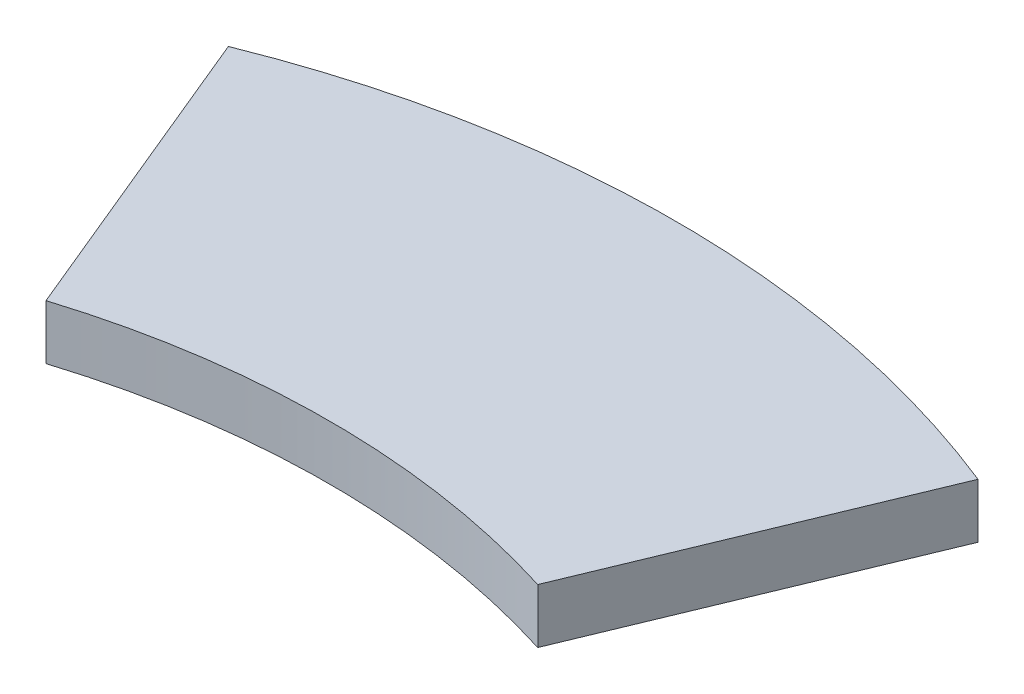
ISO-10303-21;
HEADER;
FILE_DESCRIPTION(('STEP AP214'),'2;1');
FILE_NAME('part.step','',(''),(''),'','','');
FILE_SCHEMA(('AUTOMOTIVE_DESIGN { 1 0 10303 214 1 1 1 1 }'));
ENDSEC;
DATA;
#1=APPLICATION_CONTEXT('core data for automotive mechanical design processes');
#2=APPLICATION_PROTOCOL_DEFINITION('international standard','automotive_design',2000,#1);
#3=PRODUCT_CONTEXT('',#1,'mechanical');
#4=PRODUCT('Part','Part','',(#3));
#5=PRODUCT_RELATED_PRODUCT_CATEGORY('part','',(#4));
#6=PRODUCT_DEFINITION_FORMATION('','',#4);
#7=PRODUCT_DEFINITION_CONTEXT('part definition',#1,'design');
#8=PRODUCT_DEFINITION('design','',#6,#7);
#9=PRODUCT_DEFINITION_SHAPE('','',#8);
#10=(LENGTH_UNIT() NAMED_UNIT(*) SI_UNIT(.MILLI.,.METRE.));
#11=(NAMED_UNIT(*) PLANE_ANGLE_UNIT() SI_UNIT($,.RADIAN.));
#12=(NAMED_UNIT(*) SI_UNIT($,.STERADIAN.) SOLID_ANGLE_UNIT());
#13=UNCERTAINTY_MEASURE_WITH_UNIT(LENGTH_MEASURE(1.E-05),#10,'distance_accuracy_value','');
#14=(GEOMETRIC_REPRESENTATION_CONTEXT(3) GLOBAL_UNCERTAINTY_ASSIGNED_CONTEXT((#13)) GLOBAL_UNIT_ASSIGNED_CONTEXT((#10,
#11,#12)) REPRESENTATION_CONTEXT('',''));
#15=CARTESIAN_POINT('',(0.,0.,0.));
#16=DIRECTION('',(0.,0.,1.));
#17=DIRECTION('',(1.,0.,0.));
#18=AXIS2_PLACEMENT_3D('',#15,#16,#17);
#19=CARTESIAN_POINT('',(0.444031685331886,5.,178.498422602722));
#20=DIRECTION('',(0.,-1.,0.));
#21=DIRECTION('',(0.,0.,-1.));
#22=AXIS2_PLACEMENT_3D('',#19,#20,#21);
#23=CYLINDRICAL_SURFACE('',#22,151.);
#24=CARTESIAN_POINT('',(0.444031685331886,-5.,178.498422602722));
#25=DIRECTION('',(0.,-1.,0.));
#26=DIRECTION('',(0.,0.,-1.));
#27=AXIS2_PLACEMENT_3D('',#24,#25,#26);
#28=CIRCLE('',#27,151.);
#29=CARTESIAN_POINT('',(-44.615379259522,-5.,34.3781621071803));
#30=VERTEX_POINT('',#29);
#31=CARTESIAN_POINT('',(45.5034426301858,-5.,34.3781621071803));
#32=VERTEX_POINT('',#31);
#33=EDGE_CURVE('E96',#30,#32,#28,.T.);
#34=ORIENTED_EDGE('',*,*,#33,.T.);
#35=DIRECTION('',(0.,-1.,0.));
#36=VECTOR('',#35,1.);
#37=CARTESIAN_POINT('',(45.5034426301858,5.,34.3781621071803));
#38=LINE('',#37,#36);
#39=CARTESIAN_POINT('',(45.5034426301858,5.,34.3781621071803));
#40=VERTEX_POINT('',#39);
#41=EDGE_CURVE('E11',#40,#32,#38,.T.);
#42=ORIENTED_EDGE('',*,*,#41,.F.);
#43=CARTESIAN_POINT('',(0.444031685331886,5.,178.498422602722));
#44=DIRECTION('',(0.,-1.,0.));
#45=DIRECTION('',(0.,0.,-1.));
#46=AXIS2_PLACEMENT_3D('',#43,#44,#45);
#47=CIRCLE('',#46,151.);
#48=CARTESIAN_POINT('',(-44.615379259522,5.,34.3781621071803));
#49=VERTEX_POINT('',#48);
#50=EDGE_CURVE('E84',#49,#40,#47,.T.);
#51=ORIENTED_EDGE('',*,*,#50,.F.);
#52=DIRECTION('',(0.,-1.,0.));
#53=VECTOR('',#52,1.);
#54=CARTESIAN_POINT('',(-44.615379259522,5.,34.3781621071803));
#55=LINE('',#54,#53);
#56=EDGE_CURVE('E92',#49,#30,#55,.T.);
#57=ORIENTED_EDGE('',*,*,#56,.T.);
#58=EDGE_LOOP('',(#34,#42,#51,#57));
#59=FACE_BOUND('',#58,.T.);
#60=ADVANCED_FACE('F33',(#59),#23,.F.);
#61=CARTESIAN_POINT('',(45.5034426301858,5.,34.3781621071803));
#62=DIRECTION('',(-0.923879532511287,0.,-0.38268343236509));
#63=DIRECTION('',(-0.38268343236509,0.,0.923879532511287));
#64=AXIS2_PLACEMENT_3D('',#61,#62,#63);
#65=PLANE('',#64);
#66=DIRECTION('',(0.38268343236509,0.,-0.923879532511286));
#67=VECTOR('',#66,1.);
#68=CARTESIAN_POINT('',(45.5034426301858,-5.,34.3781621071803));
#69=LINE('',#68,#67);
#70=CARTESIAN_POINT('',(69.1342621219719,-5.,-22.6716827998801));
#71=VERTEX_POINT('',#70);
#72=EDGE_CURVE('E88',#32,#71,#69,.T.);
#73=ORIENTED_EDGE('',*,*,#72,.T.);
#74=DIRECTION('',(0.,-1.,0.));
#75=VECTOR('',#74,1.);
#76=CARTESIAN_POINT('',(69.1342621219719,5.,-22.6716827998801));
#77=LINE('',#76,#75);
#78=CARTESIAN_POINT('',(69.1342621219719,5.,-22.6716827998801));
#79=VERTEX_POINT('',#78);
#80=EDGE_CURVE('E41',#79,#71,#77,.T.);
#81=ORIENTED_EDGE('',*,*,#80,.F.);
#82=DIRECTION('',(0.38268343236509,0.,-0.923879532511286));
#83=VECTOR('',#82,1.);
#84=CARTESIAN_POINT('',(45.5034426301858,5.,34.3781621071803));
#85=LINE('',#84,#83);
#86=EDGE_CURVE('E79',#40,#79,#85,.T.);
#87=ORIENTED_EDGE('',*,*,#86,.F.);
#88=ORIENTED_EDGE('',*,*,#41,.T.);
#89=EDGE_LOOP('',(#73,#81,#87,#88));
#90=FACE_BOUND('',#89,.T.);
#91=ADVANCED_FACE('F87',(#90),#65,.F.);
#92=CARTESIAN_POINT('',(0.444031685331886,5.,148.498422602722));
#93=DIRECTION('',(0.,-1.,0.));
#94=DIRECTION('',(0.,0.,-1.));
#95=AXIS2_PLACEMENT_3D('',#92,#93,#94);
#96=CYLINDRICAL_SURFACE('',#95,184.438479556129);
#97=CARTESIAN_POINT('',(0.444031685331886,-5.,148.498422602722));
#98=DIRECTION('',(0.,1.,0.));
#99=DIRECTION('',(0.,0.,1.));
#100=AXIS2_PLACEMENT_3D('',#97,#98,#99);
#101=CIRCLE('',#100,184.438479556129);
#102=CARTESIAN_POINT('',(-68.2461987513081,-5.,-22.6716827998802));
#103=VERTEX_POINT('',#102);
#104=EDGE_CURVE('E66',#71,#103,#101,.T.);
#105=ORIENTED_EDGE('',*,*,#104,.T.);
#106=DIRECTION('',(0.,-1.,0.));
#107=VECTOR('',#106,1.);
#108=CARTESIAN_POINT('',(-68.2461987513081,5.,-22.6716827998802));
#109=LINE('',#108,#107);
#110=CARTESIAN_POINT('',(-68.2461987513081,5.,-22.6716827998802));
#111=VERTEX_POINT('',#110);
#112=EDGE_CURVE('E89',#111,#103,#109,.T.);
#113=ORIENTED_EDGE('',*,*,#112,.F.);
#114=CARTESIAN_POINT('',(0.444031685331886,5.,148.498422602722));
#115=DIRECTION('',(0.,1.,0.));
#116=DIRECTION('',(0.,0.,1.));
#117=AXIS2_PLACEMENT_3D('',#114,#115,#116);
#118=CIRCLE('',#117,184.438479556129);
#119=EDGE_CURVE('E82',#79,#111,#118,.T.);
#120=ORIENTED_EDGE('',*,*,#119,.F.);
#121=ORIENTED_EDGE('',*,*,#80,.T.);
#122=EDGE_LOOP('',(#105,#113,#120,#121));
#123=FACE_BOUND('',#122,.T.);
#124=ADVANCED_FACE('F90',(#123),#96,.T.);
#125=CARTESIAN_POINT('',(-44.615379259522,5.,34.3781621071803));
#126=DIRECTION('',(0.923879532511287,0.,-0.38268343236509));
#127=DIRECTION('',(-0.38268343236509,0.,-0.923879532511287));
#128=AXIS2_PLACEMENT_3D('',#125,#126,#127);
#129=PLANE('',#128);
#130=DIRECTION('',(0.38268343236509,0.,0.923879532511286));
#131=VECTOR('',#130,1.);
#132=CARTESIAN_POINT('',(-44.615379259522,-5.,34.3781621071803));
#133=LINE('',#132,#131);
#134=EDGE_CURVE('E72',#103,#30,#133,.T.);
#135=ORIENTED_EDGE('',*,*,#134,.T.);
#136=ORIENTED_EDGE('',*,*,#56,.F.);
#137=DIRECTION('',(0.38268343236509,0.,0.923879532511286));
#138=VECTOR('',#137,1.);
#139=CARTESIAN_POINT('',(-44.615379259522,5.,34.3781621071803));
#140=LINE('',#139,#138);
#141=EDGE_CURVE('E49',#111,#49,#140,.T.);
#142=ORIENTED_EDGE('',*,*,#141,.F.);
#143=ORIENTED_EDGE('',*,*,#112,.T.);
#144=EDGE_LOOP('',(#135,#136,#142,#143));
#145=FACE_BOUND('',#144,.T.);
#146=ADVANCED_FACE('F103',(#145),#129,.F.);
#147=CARTESIAN_POINT('',(0.444031685331886,5.,178.498422602722));
#148=DIRECTION('',(0.,-1.,0.));
#149=DIRECTION('',(0.,0.,-1.));
#150=AXIS2_PLACEMENT_3D('',#147,#148,#149);
#151=PLANE('',#150);
#152=ORIENTED_EDGE('',*,*,#50,.T.);
#153=ORIENTED_EDGE('',*,*,#86,.T.);
#154=ORIENTED_EDGE('',*,*,#119,.T.);
#155=ORIENTED_EDGE('',*,*,#141,.T.);
#156=EDGE_LOOP('',(#152,#153,#154,#155));
#157=FACE_BOUND('',#156,.T.);
#158=ADVANCED_FACE('F80',(#157),#151,.F.);
#159=CARTESIAN_POINT('',(0.444031685331886,-5.,178.498422602722));
#160=DIRECTION('',(0.,-1.,0.));
#161=DIRECTION('',(0.,0.,-1.));
#162=AXIS2_PLACEMENT_3D('',#159,#160,#161);
#163=PLANE('',#162);
#164=ORIENTED_EDGE('',*,*,#33,.F.);
#165=ORIENTED_EDGE('',*,*,#134,.F.);
#166=ORIENTED_EDGE('',*,*,#104,.F.);
#167=ORIENTED_EDGE('',*,*,#72,.F.);
#168=EDGE_LOOP('',(#164,#165,#166,#167));
#169=FACE_BOUND('',#168,.T.);
#170=ADVANCED_FACE('F106',(#169),#163,.T.);
#171=CLOSED_SHELL('',(#60,#91,#124,#146,#158,#170));
#172=MANIFOLD_SOLID_BREP('B2',#171);
#173=ADVANCED_BREP_SHAPE_REPRESENTATION('',(#18,#172),#14);
#174=SHAPE_DEFINITION_REPRESENTATION(#9,#173);
ENDSEC;
END-ISO-10303-21;
